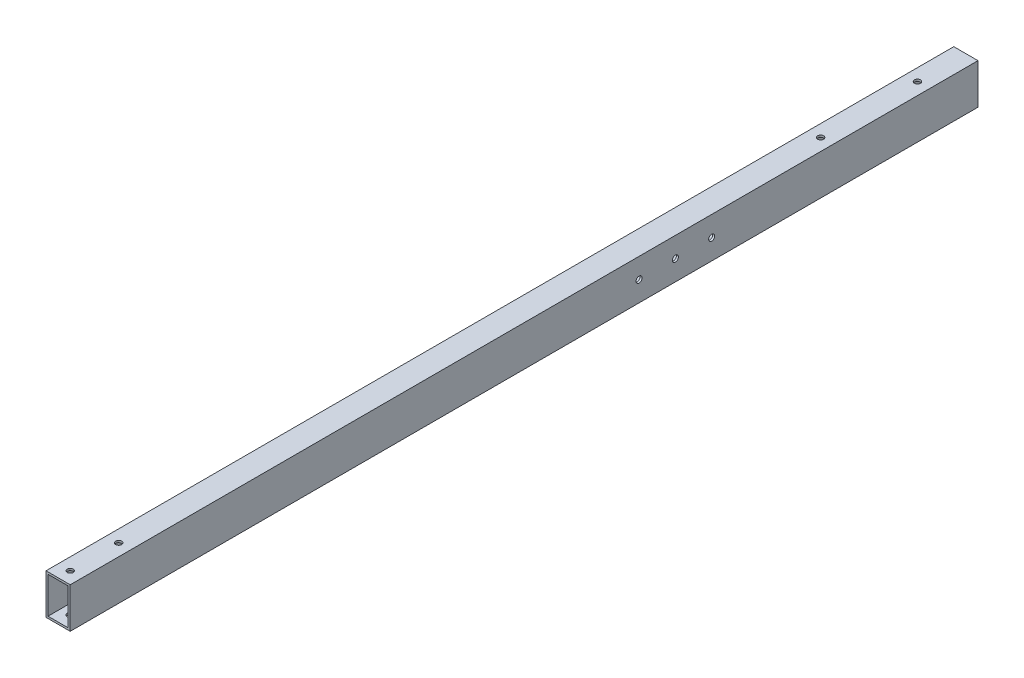
ISO-10303-21;
HEADER;
FILE_DESCRIPTION(('STEP AP214'),'2;1');
FILE_NAME('part.step','',(''),(''),'','','');
FILE_SCHEMA(('AUTOMOTIVE_DESIGN { 1 0 10303 214 1 1 1 1 }'));
ENDSEC;
DATA;
#1=APPLICATION_CONTEXT('core data for automotive mechanical design processes');
#2=APPLICATION_PROTOCOL_DEFINITION('international standard','automotive_design',2000,#1);
#3=PRODUCT_CONTEXT('',#1,'mechanical');
#4=PRODUCT('Part','Part','',(#3));
#5=PRODUCT_RELATED_PRODUCT_CATEGORY('part','',(#4));
#6=PRODUCT_DEFINITION_FORMATION('','',#4);
#7=PRODUCT_DEFINITION_CONTEXT('part definition',#1,'design');
#8=PRODUCT_DEFINITION('design','',#6,#7);
#9=PRODUCT_DEFINITION_SHAPE('','',#8);
#10=(LENGTH_UNIT() NAMED_UNIT(*) SI_UNIT(.MILLI.,.METRE.));
#11=(NAMED_UNIT(*) PLANE_ANGLE_UNIT() SI_UNIT($,.RADIAN.));
#12=(NAMED_UNIT(*) SI_UNIT($,.STERADIAN.) SOLID_ANGLE_UNIT());
#13=UNCERTAINTY_MEASURE_WITH_UNIT(LENGTH_MEASURE(1.E-05),#10,'distance_accuracy_value','');
#14=(GEOMETRIC_REPRESENTATION_CONTEXT(3) GLOBAL_UNCERTAINTY_ASSIGNED_CONTEXT((#13)) GLOBAL_UNIT_ASSIGNED_CONTEXT((#10,
#11,#12)) REPRESENTATION_CONTEXT('',''));
#15=CARTESIAN_POINT('',(0.,0.,0.));
#16=DIRECTION('',(0.,0.,1.));
#17=DIRECTION('',(1.,0.,0.));
#18=AXIS2_PLACEMENT_3D('',#15,#16,#17);
#19=CARTESIAN_POINT('',(0.,0.,450.));
#20=DIRECTION('',(0.,0.,-1.));
#21=DIRECTION('',(-1.,0.,0.));
#22=AXIS2_PLACEMENT_3D('',#19,#20,#21);
#23=PLANE('',#22);
#24=DIRECTION('',(0.,1.,0.));
#25=VECTOR('',#24,1.);
#26=CARTESIAN_POINT('',(6.,-10.,450.));
#27=LINE('',#26,#25);
#28=CARTESIAN_POINT('',(6.,-10.,450.));
#29=VERTEX_POINT('',#28);
#30=CARTESIAN_POINT('',(6.,10.,450.));
#31=VERTEX_POINT('',#30);
#32=EDGE_CURVE('E144',#29,#31,#27,.T.);
#33=ORIENTED_EDGE('',*,*,#32,.T.);
#34=DIRECTION('',(-1.,0.,0.));
#35=VECTOR('',#34,1.);
#36=CARTESIAN_POINT('',(-6.,10.,450.));
#37=LINE('',#36,#35);
#38=CARTESIAN_POINT('',(-6.,10.,450.));
#39=VERTEX_POINT('',#38);
#40=EDGE_CURVE('E147',#31,#39,#37,.T.);
#41=ORIENTED_EDGE('',*,*,#40,.T.);
#42=DIRECTION('',(0.,-1.,0.));
#43=VECTOR('',#42,1.);
#44=CARTESIAN_POINT('',(-6.,-10.,450.));
#45=LINE('',#44,#43);
#46=CARTESIAN_POINT('',(-6.,-10.,450.));
#47=VERTEX_POINT('',#46);
#48=EDGE_CURVE('E150',#39,#47,#45,.T.);
#49=ORIENTED_EDGE('',*,*,#48,.T.);
#50=DIRECTION('',(1.,0.,0.));
#51=VECTOR('',#50,1.);
#52=CARTESIAN_POINT('',(-6.,-10.,450.));
#53=LINE('',#52,#51);
#54=EDGE_CURVE('E152',#47,#29,#53,.T.);
#55=ORIENTED_EDGE('',*,*,#54,.T.);
#56=EDGE_LOOP('',(#33,#41,#49,#55));
#57=FACE_BOUND('',#56,.T.);
#58=DIRECTION('',(0.,-1.,0.));
#59=VECTOR('',#58,1.);
#60=CARTESIAN_POINT('',(-5.,-9.,450.));
#61=LINE('',#60,#59);
#62=CARTESIAN_POINT('',(-5.,9.,450.));
#63=VERTEX_POINT('',#62);
#64=CARTESIAN_POINT('',(-5.,-9.,450.));
#65=VERTEX_POINT('',#64);
#66=EDGE_CURVE('E106',#63,#65,#61,.T.);
#67=ORIENTED_EDGE('',*,*,#66,.F.);
#68=DIRECTION('',(-1.,0.,0.));
#69=VECTOR('',#68,1.);
#70=CARTESIAN_POINT('',(-5.,9.,450.));
#71=LINE('',#70,#69);
#72=CARTESIAN_POINT('',(5.,9.,450.));
#73=VERTEX_POINT('',#72);
#74=EDGE_CURVE('E128',#73,#63,#71,.T.);
#75=ORIENTED_EDGE('',*,*,#74,.F.);
#76=DIRECTION('',(0.,1.,0.));
#77=VECTOR('',#76,1.);
#78=CARTESIAN_POINT('',(5.,-9.,450.));
#79=LINE('',#78,#77);
#80=CARTESIAN_POINT('',(5.,-9.,450.));
#81=VERTEX_POINT('',#80);
#82=EDGE_CURVE('E126',#81,#73,#79,.T.);
#83=ORIENTED_EDGE('',*,*,#82,.F.);
#84=DIRECTION('',(1.,0.,0.));
#85=VECTOR('',#84,1.);
#86=CARTESIAN_POINT('',(-5.,-9.,450.));
#87=LINE('',#86,#85);
#88=EDGE_CURVE('E114',#65,#81,#87,.T.);
#89=ORIENTED_EDGE('',*,*,#88,.F.);
#90=EDGE_LOOP('',(#67,#75,#83,#89));
#91=FACE_BOUND('',#90,.T.);
#92=ADVANCED_FACE('F39',(#57,#91),#23,.F.);
#93=CARTESIAN_POINT('',(0.,0.,0.));
#94=DIRECTION('',(0.,0.,-1.));
#95=DIRECTION('',(-1.,0.,0.));
#96=AXIS2_PLACEMENT_3D('',#93,#94,#95);
#97=PLANE('',#96);
#98=DIRECTION('',(0.,1.,0.));
#99=VECTOR('',#98,1.);
#100=CARTESIAN_POINT('',(6.,-10.,0.));
#101=LINE('',#100,#99);
#102=CARTESIAN_POINT('',(6.,-10.,0.));
#103=VERTEX_POINT('',#102);
#104=CARTESIAN_POINT('',(6.,10.,0.));
#105=VERTEX_POINT('',#104);
#106=EDGE_CURVE('E122',#103,#105,#101,.T.);
#107=ORIENTED_EDGE('',*,*,#106,.F.);
#108=DIRECTION('',(1.,0.,0.));
#109=VECTOR('',#108,1.);
#110=CARTESIAN_POINT('',(-6.,-10.,0.));
#111=LINE('',#110,#109);
#112=CARTESIAN_POINT('',(-6.,-10.,0.));
#113=VERTEX_POINT('',#112);
#114=EDGE_CURVE('E148',#113,#103,#111,.T.);
#115=ORIENTED_EDGE('',*,*,#114,.F.);
#116=DIRECTION('',(0.,-1.,0.));
#117=VECTOR('',#116,1.);
#118=CARTESIAN_POINT('',(-6.,-10.,0.));
#119=LINE('',#118,#117);
#120=CARTESIAN_POINT('',(-6.,10.,0.));
#121=VERTEX_POINT('',#120);
#122=EDGE_CURVE('E159',#121,#113,#119,.T.);
#123=ORIENTED_EDGE('',*,*,#122,.F.);
#124=DIRECTION('',(-1.,0.,0.));
#125=VECTOR('',#124,1.);
#126=CARTESIAN_POINT('',(-6.,10.,0.));
#127=LINE('',#126,#125);
#128=EDGE_CURVE('E157',#105,#121,#127,.T.);
#129=ORIENTED_EDGE('',*,*,#128,.F.);
#130=EDGE_LOOP('',(#107,#115,#123,#129));
#131=FACE_BOUND('',#130,.T.);
#132=DIRECTION('',(-1.,0.,0.));
#133=VECTOR('',#132,1.);
#134=CARTESIAN_POINT('',(-5.,9.,0.));
#135=LINE('',#134,#133);
#136=CARTESIAN_POINT('',(5.,9.,0.));
#137=VERTEX_POINT('',#136);
#138=CARTESIAN_POINT('',(-5.,9.,0.));
#139=VERTEX_POINT('',#138);
#140=EDGE_CURVE('E115',#137,#139,#135,.T.);
#141=ORIENTED_EDGE('',*,*,#140,.T.);
#142=DIRECTION('',(0.,-1.,0.));
#143=VECTOR('',#142,1.);
#144=CARTESIAN_POINT('',(-5.,-9.,0.));
#145=LINE('',#144,#143);
#146=CARTESIAN_POINT('',(-5.,-9.,0.));
#147=VERTEX_POINT('',#146);
#148=EDGE_CURVE('E64',#139,#147,#145,.T.);
#149=ORIENTED_EDGE('',*,*,#148,.T.);
#150=DIRECTION('',(1.,0.,0.));
#151=VECTOR('',#150,1.);
#152=CARTESIAN_POINT('',(-5.,-9.,0.));
#153=LINE('',#152,#151);
#154=CARTESIAN_POINT('',(5.,-9.,0.));
#155=VERTEX_POINT('',#154);
#156=EDGE_CURVE('E121',#147,#155,#153,.T.);
#157=ORIENTED_EDGE('',*,*,#156,.T.);
#158=DIRECTION('',(0.,1.,0.));
#159=VECTOR('',#158,1.);
#160=CARTESIAN_POINT('',(5.,-9.,0.));
#161=LINE('',#160,#159);
#162=EDGE_CURVE('E136',#155,#137,#161,.T.);
#163=ORIENTED_EDGE('',*,*,#162,.T.);
#164=EDGE_LOOP('',(#141,#149,#157,#163));
#165=FACE_BOUND('',#164,.T.);
#166=ADVANCED_FACE('F216',(#131,#165),#97,.T.);
#167=CARTESIAN_POINT('',(6.,-10.,450.));
#168=DIRECTION('',(-1.,0.,0.));
#169=DIRECTION('',(0.,0.,1.));
#170=AXIS2_PLACEMENT_3D('',#167,#168,#169);
#171=PLANE('',#170);
#172=CARTESIAN_POINT('',(6.,0.,168.));
#173=DIRECTION('',(1.,0.,0.));
#174=DIRECTION('',(0.,0.,-1.));
#175=AXIS2_PLACEMENT_3D('',#172,#173,#174);
#176=CIRCLE('',#175,1.5);
#177=CARTESIAN_POINT('',(6.,0.,166.5));
#178=VERTEX_POINT('',#177);
#179=EDGE_CURVE('E134',#178,#178,#176,.T.);
#180=ORIENTED_EDGE('',*,*,#179,.F.);
#181=EDGE_LOOP('',(#180));
#182=FACE_BOUND('',#181,.T.);
#183=CARTESIAN_POINT('',(6.,0.,150.));
#184=DIRECTION('',(1.,0.,0.));
#185=DIRECTION('',(0.,0.,-1.));
#186=AXIS2_PLACEMENT_3D('',#183,#184,#185);
#187=CIRCLE('',#186,1.5);
#188=CARTESIAN_POINT('',(6.,0.,148.5));
#189=VERTEX_POINT('',#188);
#190=EDGE_CURVE('E203',#189,#189,#187,.T.);
#191=ORIENTED_EDGE('',*,*,#190,.F.);
#192=EDGE_LOOP('',(#191));
#193=FACE_BOUND('',#192,.T.);
#194=CARTESIAN_POINT('',(6.,0.,132.));
#195=DIRECTION('',(1.,0.,0.));
#196=DIRECTION('',(0.,0.,-1.));
#197=AXIS2_PLACEMENT_3D('',#194,#195,#196);
#198=CIRCLE('',#197,1.5);
#199=CARTESIAN_POINT('',(6.,0.,130.5));
#200=VERTEX_POINT('',#199);
#201=EDGE_CURVE('E194',#200,#200,#198,.T.);
#202=ORIENTED_EDGE('',*,*,#201,.F.);
#203=EDGE_LOOP('',(#202));
#204=FACE_BOUND('',#203,.T.);
#205=ORIENTED_EDGE('',*,*,#106,.T.);
#206=DIRECTION('',(0.,0.,-1.));
#207=VECTOR('',#206,1.);
#208=CARTESIAN_POINT('',(6.,10.,450.));
#209=LINE('',#208,#207);
#210=EDGE_CURVE('E11',#31,#105,#209,.T.);
#211=ORIENTED_EDGE('',*,*,#210,.F.);
#212=ORIENTED_EDGE('',*,*,#32,.F.);
#213=DIRECTION('',(0.,0.,-1.));
#214=VECTOR('',#213,1.);
#215=CARTESIAN_POINT('',(6.,-10.,450.));
#216=LINE('',#215,#214);
#217=EDGE_CURVE('E154',#29,#103,#216,.T.);
#218=ORIENTED_EDGE('',*,*,#217,.T.);
#219=EDGE_LOOP('',(#205,#211,#212,#218));
#220=FACE_BOUND('',#219,.T.);
#221=ADVANCED_FACE('F41',(#182,#193,#204,#220),#171,.F.);
#222=CARTESIAN_POINT('',(-6.,10.,450.));
#223=DIRECTION('',(0.,-1.,0.));
#224=DIRECTION('',(0.,0.,-1.));
#225=AXIS2_PLACEMENT_3D('',#222,#223,#224);
#226=PLANE('',#225);
#227=CARTESIAN_POINT('',(0.,10.,444.));
#228=DIRECTION('',(0.,1.,0.));
#229=DIRECTION('',(0.,0.,1.));
#230=AXIS2_PLACEMENT_3D('',#227,#228,#229);
#231=CIRCLE('',#230,1.5);
#232=CARTESIAN_POINT('',(0.,10.,445.5));
#233=VERTEX_POINT('',#232);
#234=EDGE_CURVE('E310',#233,#233,#231,.T.);
#235=ORIENTED_EDGE('',*,*,#234,.F.);
#236=EDGE_LOOP('',(#235));
#237=FACE_BOUND('',#236,.T.);
#238=CARTESIAN_POINT('',(0.,10.,72.));
#239=DIRECTION('',(0.,1.,0.));
#240=DIRECTION('',(0.,0.,1.));
#241=AXIS2_PLACEMENT_3D('',#238,#239,#240);
#242=CIRCLE('',#241,1.5);
#243=CARTESIAN_POINT('',(0.,10.,73.5));
#244=VERTEX_POINT('',#243);
#245=EDGE_CURVE('E316',#244,#244,#242,.T.);
#246=ORIENTED_EDGE('',*,*,#245,.F.);
#247=EDGE_LOOP('',(#246));
#248=FACE_BOUND('',#247,.T.);
#249=CARTESIAN_POINT('',(0.,10.,24.));
#250=DIRECTION('',(0.,1.,0.));
#251=DIRECTION('',(0.,0.,1.));
#252=AXIS2_PLACEMENT_3D('',#249,#250,#251);
#253=CIRCLE('',#252,1.5);
#254=CARTESIAN_POINT('',(0.,10.,25.5));
#255=VERTEX_POINT('',#254);
#256=EDGE_CURVE('E328',#255,#255,#253,.T.);
#257=ORIENTED_EDGE('',*,*,#256,.F.);
#258=EDGE_LOOP('',(#257));
#259=FACE_BOUND('',#258,.T.);
#260=CARTESIAN_POINT('',(0.,10.,420.));
#261=DIRECTION('',(0.,1.,0.));
#262=DIRECTION('',(0.,0.,1.));
#263=AXIS2_PLACEMENT_3D('',#260,#261,#262);
#264=CIRCLE('',#263,1.5);
#265=CARTESIAN_POINT('',(0.,10.,421.5));
#266=VERTEX_POINT('',#265);
#267=EDGE_CURVE('E313',#266,#266,#264,.T.);
#268=ORIENTED_EDGE('',*,*,#267,.F.);
#269=EDGE_LOOP('',(#268));
#270=FACE_BOUND('',#269,.T.);
#271=ORIENTED_EDGE('',*,*,#128,.T.);
#272=DIRECTION('',(0.,0.,-1.));
#273=VECTOR('',#272,1.);
#274=CARTESIAN_POINT('',(-6.,10.,450.));
#275=LINE('',#274,#273);
#276=EDGE_CURVE('E48',#39,#121,#275,.T.);
#277=ORIENTED_EDGE('',*,*,#276,.F.);
#278=ORIENTED_EDGE('',*,*,#40,.F.);
#279=ORIENTED_EDGE('',*,*,#210,.T.);
#280=EDGE_LOOP('',(#271,#277,#278,#279));
#281=FACE_BOUND('',#280,.T.);
#282=ADVANCED_FACE('F215',(#237,#248,#259,#270,#281),#226,.F.);
#283=CARTESIAN_POINT('',(-6.,-10.,450.));
#284=DIRECTION('',(1.,0.,0.));
#285=DIRECTION('',(0.,0.,-1.));
#286=AXIS2_PLACEMENT_3D('',#283,#284,#285);
#287=PLANE('',#286);
#288=ORIENTED_EDGE('',*,*,#122,.T.);
#289=DIRECTION('',(0.,0.,-1.));
#290=VECTOR('',#289,1.);
#291=CARTESIAN_POINT('',(-6.,-10.,450.));
#292=LINE('',#291,#290);
#293=EDGE_CURVE('E164',#47,#113,#292,.T.);
#294=ORIENTED_EDGE('',*,*,#293,.F.);
#295=ORIENTED_EDGE('',*,*,#48,.F.);
#296=ORIENTED_EDGE('',*,*,#276,.T.);
#297=EDGE_LOOP('',(#288,#294,#295,#296));
#298=FACE_BOUND('',#297,.T.);
#299=ADVANCED_FACE('F235',(#298),#287,.F.);
#300=CARTESIAN_POINT('',(-6.,-10.,450.));
#301=DIRECTION('',(0.,1.,0.));
#302=DIRECTION('',(0.,0.,1.));
#303=AXIS2_PLACEMENT_3D('',#300,#301,#302);
#304=PLANE('',#303);
#305=CARTESIAN_POINT('',(0.,-10.,444.));
#306=DIRECTION('',(0.,1.,0.));
#307=DIRECTION('',(0.,0.,1.));
#308=AXIS2_PLACEMENT_3D('',#305,#306,#307);
#309=CIRCLE('',#308,1.5);
#310=CARTESIAN_POINT('',(0.,-10.,445.5));
#311=VERTEX_POINT('',#310);
#312=EDGE_CURVE('E173',#311,#311,#309,.T.);
#313=ORIENTED_EDGE('',*,*,#312,.T.);
#314=EDGE_LOOP('',(#313));
#315=FACE_BOUND('',#314,.T.);
#316=CARTESIAN_POINT('',(0.,-10.,72.));
#317=DIRECTION('',(0.,1.,0.));
#318=DIRECTION('',(0.,0.,1.));
#319=AXIS2_PLACEMENT_3D('',#316,#317,#318);
#320=CIRCLE('',#319,1.5);
#321=CARTESIAN_POINT('',(0.,-10.,73.5));
#322=VERTEX_POINT('',#321);
#323=EDGE_CURVE('E320',#322,#322,#320,.T.);
#324=ORIENTED_EDGE('',*,*,#323,.T.);
#325=EDGE_LOOP('',(#324));
#326=FACE_BOUND('',#325,.T.);
#327=CARTESIAN_POINT('',(0.,-10.,24.));
#328=DIRECTION('',(0.,1.,0.));
#329=DIRECTION('',(0.,0.,1.));
#330=AXIS2_PLACEMENT_3D('',#327,#328,#329);
#331=CIRCLE('',#330,1.5);
#332=CARTESIAN_POINT('',(0.,-10.,25.5));
#333=VERTEX_POINT('',#332);
#334=EDGE_CURVE('E319',#333,#333,#331,.T.);
#335=ORIENTED_EDGE('',*,*,#334,.T.);
#336=EDGE_LOOP('',(#335));
#337=FACE_BOUND('',#336,.T.);
#338=CARTESIAN_POINT('',(0.,-10.,420.));
#339=DIRECTION('',(0.,1.,0.));
#340=DIRECTION('',(0.,0.,1.));
#341=AXIS2_PLACEMENT_3D('',#338,#339,#340);
#342=CIRCLE('',#341,1.5);
#343=CARTESIAN_POINT('',(0.,-10.,421.5));
#344=VERTEX_POINT('',#343);
#345=EDGE_CURVE('E325',#344,#344,#342,.T.);
#346=ORIENTED_EDGE('',*,*,#345,.T.);
#347=EDGE_LOOP('',(#346));
#348=FACE_BOUND('',#347,.T.);
#349=ORIENTED_EDGE('',*,*,#114,.T.);
#350=ORIENTED_EDGE('',*,*,#217,.F.);
#351=ORIENTED_EDGE('',*,*,#54,.F.);
#352=ORIENTED_EDGE('',*,*,#293,.T.);
#353=EDGE_LOOP('',(#349,#350,#351,#352));
#354=FACE_BOUND('',#353,.T.);
#355=ADVANCED_FACE('F233',(#315,#326,#337,#348,#354),#304,.F.);
#356=CARTESIAN_POINT('',(-5.,-9.,450.));
#357=DIRECTION('',(1.,0.,0.));
#358=DIRECTION('',(0.,0.,-1.));
#359=AXIS2_PLACEMENT_3D('',#356,#357,#358);
#360=PLANE('',#359);
#361=ORIENTED_EDGE('',*,*,#148,.F.);
#362=DIRECTION('',(0.,0.,-1.));
#363=VECTOR('',#362,1.);
#364=CARTESIAN_POINT('',(-5.,9.,450.));
#365=LINE('',#364,#363);
#366=EDGE_CURVE('E110',#63,#139,#365,.T.);
#367=ORIENTED_EDGE('',*,*,#366,.F.);
#368=ORIENTED_EDGE('',*,*,#66,.T.);
#369=DIRECTION('',(0.,0.,-1.));
#370=VECTOR('',#369,1.);
#371=CARTESIAN_POINT('',(-5.,-9.,450.));
#372=LINE('',#371,#370);
#373=EDGE_CURVE('E109',#65,#147,#372,.T.);
#374=ORIENTED_EDGE('',*,*,#373,.T.);
#375=EDGE_LOOP('',(#361,#367,#368,#374));
#376=FACE_BOUND('',#375,.T.);
#377=ADVANCED_FACE('F108',(#376),#360,.T.);
#378=CARTESIAN_POINT('',(-5.,-9.,450.));
#379=DIRECTION('',(0.,1.,0.));
#380=DIRECTION('',(0.,0.,1.));
#381=AXIS2_PLACEMENT_3D('',#378,#379,#380);
#382=PLANE('',#381);
#383=CARTESIAN_POINT('',(0.,-9.,444.));
#384=DIRECTION('',(0.,1.,0.));
#385=DIRECTION('',(0.,0.,1.));
#386=AXIS2_PLACEMENT_3D('',#383,#384,#385);
#387=CIRCLE('',#386,1.5);
#388=CARTESIAN_POINT('',(0.,-9.,445.5));
#389=VERTEX_POINT('',#388);
#390=EDGE_CURVE('E191',#389,#389,#387,.T.);
#391=ORIENTED_EDGE('',*,*,#390,.F.);
#392=EDGE_LOOP('',(#391));
#393=FACE_BOUND('',#392,.T.);
#394=CARTESIAN_POINT('',(0.,-9.,72.));
#395=DIRECTION('',(0.,1.,0.));
#396=DIRECTION('',(0.,0.,1.));
#397=AXIS2_PLACEMENT_3D('',#394,#395,#396);
#398=CIRCLE('',#397,1.5);
#399=CARTESIAN_POINT('',(0.,-9.,73.5));
#400=VERTEX_POINT('',#399);
#401=EDGE_CURVE('E179',#400,#400,#398,.T.);
#402=ORIENTED_EDGE('',*,*,#401,.F.);
#403=EDGE_LOOP('',(#402));
#404=FACE_BOUND('',#403,.T.);
#405=CARTESIAN_POINT('',(0.,-9.,24.));
#406=DIRECTION('',(0.,1.,0.));
#407=DIRECTION('',(0.,0.,1.));
#408=AXIS2_PLACEMENT_3D('',#405,#406,#407);
#409=CIRCLE('',#408,1.5);
#410=CARTESIAN_POINT('',(0.,-9.,25.5));
#411=VERTEX_POINT('',#410);
#412=EDGE_CURVE('E176',#411,#411,#409,.T.);
#413=ORIENTED_EDGE('',*,*,#412,.F.);
#414=EDGE_LOOP('',(#413));
#415=FACE_BOUND('',#414,.T.);
#416=CARTESIAN_POINT('',(0.,-9.,420.));
#417=DIRECTION('',(0.,1.,0.));
#418=DIRECTION('',(0.,0.,1.));
#419=AXIS2_PLACEMENT_3D('',#416,#417,#418);
#420=CIRCLE('',#419,1.5);
#421=CARTESIAN_POINT('',(0.,-9.,421.5));
#422=VERTEX_POINT('',#421);
#423=EDGE_CURVE('E172',#422,#422,#420,.T.);
#424=ORIENTED_EDGE('',*,*,#423,.F.);
#425=EDGE_LOOP('',(#424));
#426=FACE_BOUND('',#425,.T.);
#427=ORIENTED_EDGE('',*,*,#156,.F.);
#428=ORIENTED_EDGE('',*,*,#373,.F.);
#429=ORIENTED_EDGE('',*,*,#88,.T.);
#430=DIRECTION('',(0.,0.,-1.));
#431=VECTOR('',#430,1.);
#432=CARTESIAN_POINT('',(5.,-9.,450.));
#433=LINE('',#432,#431);
#434=EDGE_CURVE('E123',#81,#155,#433,.T.);
#435=ORIENTED_EDGE('',*,*,#434,.T.);
#436=EDGE_LOOP('',(#427,#428,#429,#435));
#437=FACE_BOUND('',#436,.T.);
#438=ADVANCED_FACE('F118',(#393,#404,#415,#426,#437),#382,.T.);
#439=CARTESIAN_POINT('',(5.,-9.,450.));
#440=DIRECTION('',(-1.,0.,0.));
#441=DIRECTION('',(0.,-1.,0.));
#442=AXIS2_PLACEMENT_3D('',#439,#440,#441);
#443=PLANE('',#442);
#444=CARTESIAN_POINT('',(5.,0.,168.));
#445=DIRECTION('',(-1.,0.,0.));
#446=DIRECTION('',(0.,-1.,0.));
#447=AXIS2_PLACEMENT_3D('',#444,#445,#446);
#448=CIRCLE('',#447,1.5);
#449=CARTESIAN_POINT('',(5.,-1.50000000000002,168.));
#450=VERTEX_POINT('',#449);
#451=EDGE_CURVE('E197',#450,#450,#448,.F.);
#452=ORIENTED_EDGE('',*,*,#451,.T.);
#453=EDGE_LOOP('',(#452));
#454=FACE_BOUND('',#453,.T.);
#455=CARTESIAN_POINT('',(5.,0.,150.));
#456=DIRECTION('',(-1.,0.,0.));
#457=DIRECTION('',(0.,-1.,0.));
#458=AXIS2_PLACEMENT_3D('',#455,#456,#457);
#459=CIRCLE('',#458,1.5);
#460=CARTESIAN_POINT('',(5.,-1.50000000000002,150.));
#461=VERTEX_POINT('',#460);
#462=EDGE_CURVE('E200',#461,#461,#459,.F.);
#463=ORIENTED_EDGE('',*,*,#462,.T.);
#464=EDGE_LOOP('',(#463));
#465=FACE_BOUND('',#464,.T.);
#466=CARTESIAN_POINT('',(5.,0.,132.));
#467=DIRECTION('',(-1.,0.,0.));
#468=DIRECTION('',(0.,-1.,0.));
#469=AXIS2_PLACEMENT_3D('',#466,#467,#468);
#470=CIRCLE('',#469,1.5);
#471=CARTESIAN_POINT('',(5.,-1.50000000000002,132.));
#472=VERTEX_POINT('',#471);
#473=EDGE_CURVE('E206',#472,#472,#470,.F.);
#474=ORIENTED_EDGE('',*,*,#473,.T.);
#475=EDGE_LOOP('',(#474));
#476=FACE_BOUND('',#475,.T.);
#477=ORIENTED_EDGE('',*,*,#162,.F.);
#478=ORIENTED_EDGE('',*,*,#434,.F.);
#479=ORIENTED_EDGE('',*,*,#82,.T.);
#480=DIRECTION('',(0.,0.,-1.));
#481=VECTOR('',#480,1.);
#482=CARTESIAN_POINT('',(5.,9.,450.));
#483=LINE('',#482,#481);
#484=EDGE_CURVE('E56',#73,#137,#483,.T.);
#485=ORIENTED_EDGE('',*,*,#484,.T.);
#486=EDGE_LOOP('',(#477,#478,#479,#485));
#487=FACE_BOUND('',#486,.T.);
#488=ADVANCED_FACE('F256',(#454,#465,#476,#487),#443,.T.);
#489=CARTESIAN_POINT('',(-5.,9.,450.));
#490=DIRECTION('',(0.,-1.,0.));
#491=DIRECTION('',(0.,0.,-1.));
#492=AXIS2_PLACEMENT_3D('',#489,#490,#491);
#493=PLANE('',#492);
#494=CARTESIAN_POINT('',(0.,9.,444.));
#495=DIRECTION('',(0.,-1.,0.));
#496=DIRECTION('',(0.,0.,-1.));
#497=AXIS2_PLACEMENT_3D('',#494,#495,#496);
#498=CIRCLE('',#497,1.5);
#499=CARTESIAN_POINT('',(0.,9.,442.5));
#500=VERTEX_POINT('',#499);
#501=EDGE_CURVE('E43',#500,#500,#498,.T.);
#502=ORIENTED_EDGE('',*,*,#501,.F.);
#503=EDGE_LOOP('',(#502));
#504=FACE_BOUND('',#503,.T.);
#505=CARTESIAN_POINT('',(0.,9.,72.));
#506=DIRECTION('',(0.,-1.,0.));
#507=DIRECTION('',(0.,0.,-1.));
#508=AXIS2_PLACEMENT_3D('',#505,#506,#507);
#509=CIRCLE('',#508,1.5);
#510=CARTESIAN_POINT('',(0.,9.,70.5));
#511=VERTEX_POINT('',#510);
#512=EDGE_CURVE('E177',#511,#511,#509,.T.);
#513=ORIENTED_EDGE('',*,*,#512,.F.);
#514=EDGE_LOOP('',(#513));
#515=FACE_BOUND('',#514,.T.);
#516=CARTESIAN_POINT('',(0.,9.,24.));
#517=DIRECTION('',(0.,-1.,0.));
#518=DIRECTION('',(0.,0.,-1.));
#519=AXIS2_PLACEMENT_3D('',#516,#517,#518);
#520=CIRCLE('',#519,1.5);
#521=CARTESIAN_POINT('',(0.,9.,22.5));
#522=VERTEX_POINT('',#521);
#523=EDGE_CURVE('E174',#522,#522,#520,.T.);
#524=ORIENTED_EDGE('',*,*,#523,.F.);
#525=EDGE_LOOP('',(#524));
#526=FACE_BOUND('',#525,.T.);
#527=CARTESIAN_POINT('',(0.,9.,420.));
#528=DIRECTION('',(0.,-1.,0.));
#529=DIRECTION('',(0.,0.,-1.));
#530=AXIS2_PLACEMENT_3D('',#527,#528,#529);
#531=CIRCLE('',#530,1.5);
#532=CARTESIAN_POINT('',(0.,9.,418.5));
#533=VERTEX_POINT('',#532);
#534=EDGE_CURVE('E169',#533,#533,#531,.T.);
#535=ORIENTED_EDGE('',*,*,#534,.F.);
#536=EDGE_LOOP('',(#535));
#537=FACE_BOUND('',#536,.T.);
#538=ORIENTED_EDGE('',*,*,#140,.F.);
#539=ORIENTED_EDGE('',*,*,#484,.F.);
#540=ORIENTED_EDGE('',*,*,#74,.T.);
#541=ORIENTED_EDGE('',*,*,#366,.T.);
#542=EDGE_LOOP('',(#538,#539,#540,#541));
#543=FACE_BOUND('',#542,.T.);
#544=ADVANCED_FACE('F260',(#504,#515,#526,#537,#543),#493,.T.);
#545=CARTESIAN_POINT('',(-6.001,0.,132.));
#546=DIRECTION('',(1.,0.,0.));
#547=DIRECTION('',(0.,0.,-1.));
#548=AXIS2_PLACEMENT_3D('',#545,#546,#547);
#549=CYLINDRICAL_SURFACE('',#548,1.5);
#550=ORIENTED_EDGE('',*,*,#473,.F.);
#551=EDGE_LOOP('',(#550));
#552=FACE_BOUND('',#551,.T.);
#553=ORIENTED_EDGE('',*,*,#201,.T.);
#554=EDGE_LOOP('',(#553));
#555=FACE_BOUND('',#554,.T.);
#556=ADVANCED_FACE('F211',(#552,#555),#549,.F.);
#557=CARTESIAN_POINT('',(-6.001,0.,150.));
#558=DIRECTION('',(1.,0.,0.));
#559=DIRECTION('',(0.,0.,-1.));
#560=AXIS2_PLACEMENT_3D('',#557,#558,#559);
#561=CYLINDRICAL_SURFACE('',#560,1.5);
#562=ORIENTED_EDGE('',*,*,#462,.F.);
#563=EDGE_LOOP('',(#562));
#564=FACE_BOUND('',#563,.T.);
#565=ORIENTED_EDGE('',*,*,#190,.T.);
#566=EDGE_LOOP('',(#565));
#567=FACE_BOUND('',#566,.T.);
#568=ADVANCED_FACE('F267',(#564,#567),#561,.F.);
#569=CARTESIAN_POINT('',(-6.001,0.,168.));
#570=DIRECTION('',(1.,0.,0.));
#571=DIRECTION('',(0.,0.,-1.));
#572=AXIS2_PLACEMENT_3D('',#569,#570,#571);
#573=CYLINDRICAL_SURFACE('',#572,1.5);
#574=ORIENTED_EDGE('',*,*,#451,.F.);
#575=EDGE_LOOP('',(#574));
#576=FACE_BOUND('',#575,.T.);
#577=ORIENTED_EDGE('',*,*,#179,.T.);
#578=EDGE_LOOP('',(#577));
#579=FACE_BOUND('',#578,.T.);
#580=ADVANCED_FACE('F271',(#576,#579),#573,.F.);
#581=CARTESIAN_POINT('',(0.,-10.,420.));
#582=DIRECTION('',(0.,1.,0.));
#583=DIRECTION('',(0.,0.,1.));
#584=AXIS2_PLACEMENT_3D('',#581,#582,#583);
#585=CYLINDRICAL_SURFACE('',#584,1.5);
#586=ORIENTED_EDGE('',*,*,#534,.T.);
#587=EDGE_LOOP('',(#586));
#588=FACE_BOUND('',#587,.T.);
#589=ORIENTED_EDGE('',*,*,#267,.T.);
#590=EDGE_LOOP('',(#589));
#591=FACE_BOUND('',#590,.T.);
#592=ADVANCED_FACE('F275',(#588,#591),#585,.F.);
#593=CARTESIAN_POINT('',(0.,-10.,24.));
#594=DIRECTION('',(0.,1.,0.));
#595=DIRECTION('',(0.,0.,1.));
#596=AXIS2_PLACEMENT_3D('',#593,#594,#595);
#597=CYLINDRICAL_SURFACE('',#596,1.5);
#598=ORIENTED_EDGE('',*,*,#523,.T.);
#599=EDGE_LOOP('',(#598));
#600=FACE_BOUND('',#599,.T.);
#601=ORIENTED_EDGE('',*,*,#256,.T.);
#602=EDGE_LOOP('',(#601));
#603=FACE_BOUND('',#602,.T.);
#604=ADVANCED_FACE('F277',(#600,#603),#597,.F.);
#605=CARTESIAN_POINT('',(0.,-10.,72.));
#606=DIRECTION('',(0.,1.,0.));
#607=DIRECTION('',(0.,0.,1.));
#608=AXIS2_PLACEMENT_3D('',#605,#606,#607);
#609=CYLINDRICAL_SURFACE('',#608,1.5);
#610=ORIENTED_EDGE('',*,*,#512,.T.);
#611=EDGE_LOOP('',(#610));
#612=FACE_BOUND('',#611,.T.);
#613=ORIENTED_EDGE('',*,*,#245,.T.);
#614=EDGE_LOOP('',(#613));
#615=FACE_BOUND('',#614,.T.);
#616=ADVANCED_FACE('F280',(#612,#615),#609,.F.);
#617=CARTESIAN_POINT('',(0.,-10.,444.));
#618=DIRECTION('',(0.,1.,0.));
#619=DIRECTION('',(0.,0.,1.));
#620=AXIS2_PLACEMENT_3D('',#617,#618,#619);
#621=CYLINDRICAL_SURFACE('',#620,1.5);
#622=ORIENTED_EDGE('',*,*,#501,.T.);
#623=EDGE_LOOP('',(#622));
#624=FACE_BOUND('',#623,.T.);
#625=ORIENTED_EDGE('',*,*,#234,.T.);
#626=EDGE_LOOP('',(#625));
#627=FACE_BOUND('',#626,.T.);
#628=ADVANCED_FACE('F289',(#624,#627),#621,.F.);
#629=ORIENTED_EDGE('',*,*,#423,.T.);
#630=EDGE_LOOP('',(#629));
#631=FACE_BOUND('',#630,.T.);
#632=ORIENTED_EDGE('',*,*,#345,.F.);
#633=EDGE_LOOP('',(#632));
#634=FACE_BOUND('',#633,.T.);
#635=ADVANCED_FACE('F286',(#631,#634),#585,.F.);
#636=ORIENTED_EDGE('',*,*,#412,.T.);
#637=EDGE_LOOP('',(#636));
#638=FACE_BOUND('',#637,.T.);
#639=ORIENTED_EDGE('',*,*,#334,.F.);
#640=EDGE_LOOP('',(#639));
#641=FACE_BOUND('',#640,.T.);
#642=ADVANCED_FACE('F282',(#638,#641),#597,.F.);
#643=ORIENTED_EDGE('',*,*,#401,.T.);
#644=EDGE_LOOP('',(#643));
#645=FACE_BOUND('',#644,.T.);
#646=ORIENTED_EDGE('',*,*,#323,.F.);
#647=EDGE_LOOP('',(#646));
#648=FACE_BOUND('',#647,.T.);
#649=ADVANCED_FACE('F290',(#645,#648),#609,.F.);
#650=ORIENTED_EDGE('',*,*,#390,.T.);
#651=EDGE_LOOP('',(#650));
#652=FACE_BOUND('',#651,.T.);
#653=ORIENTED_EDGE('',*,*,#312,.F.);
#654=EDGE_LOOP('',(#653));
#655=FACE_BOUND('',#654,.T.);
#656=ADVANCED_FACE('F293',(#652,#655),#621,.F.);
#657=CLOSED_SHELL('',(#92,#166,#221,#282,#299,#355,#377,#438,#488,#544,#556,#568,#580,#592,#604,
#616,#628,#635,#642,#649,#656));
#658=MANIFOLD_SOLID_BREP('B2',#657);
#659=ADVANCED_BREP_SHAPE_REPRESENTATION('',(#18,#658),#14);
#660=SHAPE_DEFINITION_REPRESENTATION(#9,#659);
ENDSEC;
END-ISO-10303-21;
